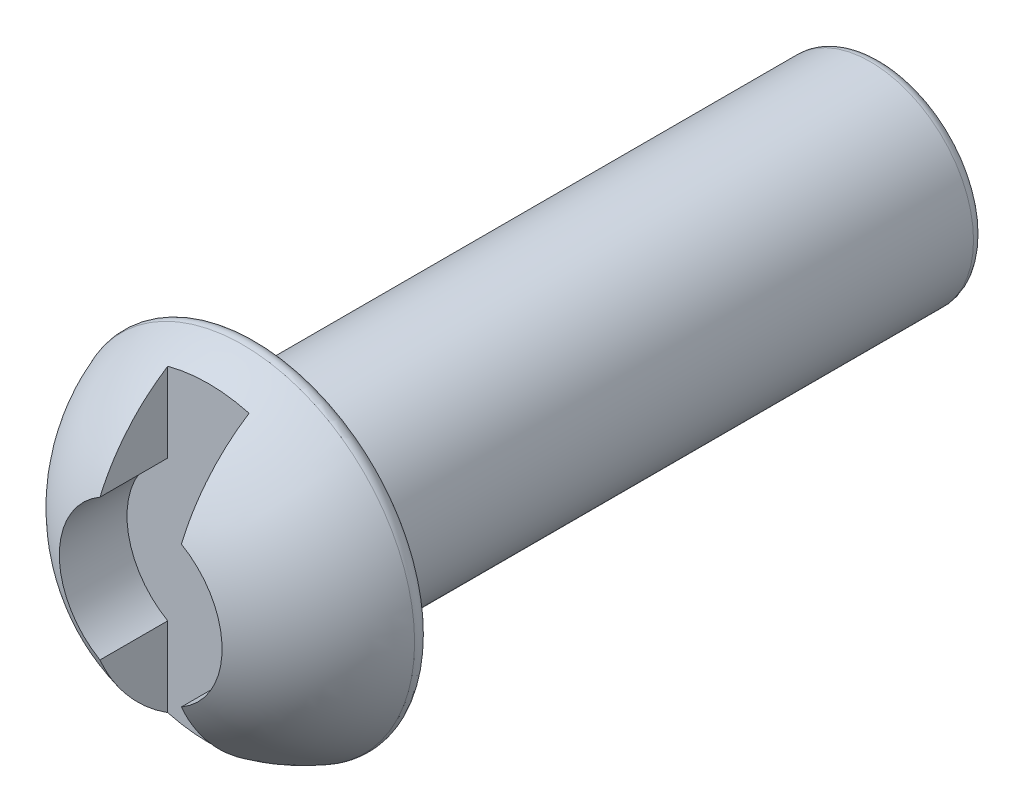
ISO-10303-21;
HEADER;
FILE_DESCRIPTION(('STEP AP214'),'2;1');
FILE_NAME('part.step','',(''),(''),'','','');
FILE_SCHEMA(('AUTOMOTIVE_DESIGN { 1 0 10303 214 1 1 1 1 }'));
ENDSEC;
DATA;
#1=APPLICATION_CONTEXT('core data for automotive mechanical design processes');
#2=APPLICATION_PROTOCOL_DEFINITION('international standard','automotive_design',2000,#1);
#3=PRODUCT_CONTEXT('',#1,'mechanical');
#4=PRODUCT('Part','Part','',(#3));
#5=PRODUCT_RELATED_PRODUCT_CATEGORY('part','',(#4));
#6=PRODUCT_DEFINITION_FORMATION('','',#4);
#7=PRODUCT_DEFINITION_CONTEXT('part definition',#1,'design');
#8=PRODUCT_DEFINITION('design','',#6,#7);
#9=PRODUCT_DEFINITION_SHAPE('','',#8);
#10=(LENGTH_UNIT() NAMED_UNIT(*) SI_UNIT(.MILLI.,.METRE.));
#11=(NAMED_UNIT(*) PLANE_ANGLE_UNIT() SI_UNIT($,.RADIAN.));
#12=(NAMED_UNIT(*) SI_UNIT($,.STERADIAN.) SOLID_ANGLE_UNIT());
#13=UNCERTAINTY_MEASURE_WITH_UNIT(LENGTH_MEASURE(1.E-05),#10,'distance_accuracy_value','');
#14=(GEOMETRIC_REPRESENTATION_CONTEXT(3) GLOBAL_UNCERTAINTY_ASSIGNED_CONTEXT((#13)) GLOBAL_UNIT_ASSIGNED_CONTEXT((#10,
#11,#12)) REPRESENTATION_CONTEXT('',''));
#15=CARTESIAN_POINT('',(0.,0.,0.));
#16=DIRECTION('',(0.,0.,1.));
#17=DIRECTION('',(1.,0.,0.));
#18=AXIS2_PLACEMENT_3D('',#15,#16,#17);
#19=CARTESIAN_POINT('',(0.,0.,-1.67999972471323));
#20=DIRECTION('',(0.,0.,1.));
#21=DIRECTION('',(1.,0.,0.));
#22=AXIS2_PLACEMENT_3D('',#19,#20,#21);
#23=DEGENERATE_TOROIDAL_SURFACE('',#22,0.000961750220595668,1.68,.T.);
#24=CARTESIAN_POINT('',(0.,0.,-1.11645571362575));
#25=DIRECTION('',(0.,0.,-1.));
#26=DIRECTION('',(-1.,0.,0.));
#27=AXIS2_PLACEMENT_3D('',#24,#25,#26);
#28=CIRCLE('',#27,1.58362347894453);
#29=CARTESIAN_POINT('',(-1.58362347894453,0.,-1.11645571362575));
#30=VERTEX_POINT('',#29);
#31=EDGE_CURVE('E170',#30,#30,#28,.F.);
#32=ORIENTED_EDGE('',*,*,#31,.T.);
#33=EDGE_LOOP('',(#32));
#34=FACE_BOUND('',#33,.T.);
#35=CARTESIAN_POINT('',(-0.375,-1.08816453655686,-0.455301433851489));
#36=CARTESIAN_POINT('',(-0.375,-1.0193633155418,-0.394226964882375));
#37=CARTESIAN_POINT('',(-0.375,-0.945353952070427,-0.338918499950808));
#38=CARTESIAN_POINT('',(-0.375,-0.789038613208102,-0.241468010537382));
#39=CARTESIAN_POINT('',(-0.375,-0.706722851960601,-0.199341761416896));
#40=CARTESIAN_POINT('',(-0.375,-0.536217463997199,-0.129522533491173));
#41=CARTESIAN_POINT('',(-0.375,-0.448030543617562,-0.101822955893846));
#42=CARTESIAN_POINT('',(-0.375,-0.268282595523437,-0.0616187256035907));
#43=CARTESIAN_POINT('',(-0.375,-0.176722315763622,-0.0491107252163106));
#44=CARTESIAN_POINT('',(-0.375,0.00729905673853977,-0.0395969264894861));
#45=CARTESIAN_POINT('',(-0.375,0.0997610123577057,-0.0426078143593755));
#46=CARTESIAN_POINT('',(-0.375,0.282873015912053,-0.0640969128108682));
#47=CARTESIAN_POINT('',(-0.375,0.373523022470033,-0.08257547619611));
#48=CARTESIAN_POINT('',(-0.375,0.550498602514875,-0.134517893951816));
#49=CARTESIAN_POINT('',(-0.375,0.636820855391359,-0.167993065062838));
#50=CARTESIAN_POINT('',(-0.375,0.802607082722554,-0.248982840807908));
#51=CARTESIAN_POINT('',(-0.375,0.882071050110512,-0.296497459907932));
#52=CARTESIAN_POINT('',(-0.375,1.03175712880534,-0.404128815118014));
#53=CARTESIAN_POINT('',(-0.375,1.1019936602616,-0.464225498019089));
#54=CARTESIAN_POINT('',(-0.375,1.23137722857827,-0.595359776892776));
#55=CARTESIAN_POINT('',(-0.375,1.29052433355385,-0.666397305657974));
#56=CARTESIAN_POINT('',(-0.375,1.39603688605121,-0.817378410836047));
#57=CARTESIAN_POINT('',(-0.375,1.44240531397182,-0.897319904439824));
#58=CARTESIAN_POINT('',(-0.375,1.52106240687032,-1.06385315568539));
#59=CARTESIAN_POINT('',(-0.375,1.5533510643779,-1.15044491685559));
#60=CARTESIAN_POINT('',(-0.375,1.6029307219788,-1.32781653535508));
#61=CARTESIAN_POINT('',(-0.375,1.62022236367697,-1.41859621334119));
#62=CARTESIAN_POINT('',(-0.375,1.63931943924794,-1.60177011922113));
#63=CARTESIAN_POINT('',(-0.375,1.6411248725501,-1.69416434717446));
#64=CARTESIAN_POINT('',(-0.375,1.62919832889859,-1.87794356444425));
#65=CARTESIAN_POINT('',(-0.375,1.61546650624284,-1.96932856377409));
#66=CARTESIAN_POINT('',(-0.375,1.57285556685113,-2.14849601166505));
#67=CARTESIAN_POINT('',(-0.375,1.54397646701572,-2.23627846424558));
#68=CARTESIAN_POINT('',(-0.375,1.4718908366213,-2.40574911606736));
#69=CARTESIAN_POINT('',(-0.375,1.42868430112963,-2.48743731321048));
#70=CARTESIAN_POINT('',(-0.375,1.3291702504303,-2.64240093326247));
#71=CARTESIAN_POINT('',(-0.375,1.27286268846168,-2.71567632614248));
#72=CARTESIAN_POINT('',(-0.375,1.14874406505465,-2.85173552775054));
#73=CARTESIAN_POINT('',(-0.375,1.08093278423466,-2.91451913634977));
#74=CARTESIAN_POINT('',(-0.375,0.935733492673192,-3.02781078947794));
#75=CARTESIAN_POINT('',(-0.375,0.858345577294134,-3.0783189562287));
#76=CARTESIAN_POINT('',(-0.375,0.696184820086576,-3.16563116108362));
#77=CARTESIAN_POINT('',(-0.375,0.611411535376129,-3.20243437663747));
#78=CARTESIAN_POINT('',(-0.375,0.436889940549795,-3.26129169957216));
#79=CARTESIAN_POINT('',(-0.375,0.347141557060869,-3.2833455893664));
#80=CARTESIAN_POINT('',(-0.375,0.165177528852073,-3.31210121830764));
#81=CARTESIAN_POINT('',(-0.375,0.0729607773299847,-3.31879594975541));
#82=CARTESIAN_POINT('',(-0.375,-0.11129167272008,-3.31664485302977));
#83=CARTESIAN_POINT('',(-0.375,-0.203327370463088,-3.30779895762718));
#84=CARTESIAN_POINT('',(-0.375,-0.384762730010887,-3.274763575842));
#85=CARTESIAN_POINT('',(-0.375,-0.474157760193703,-3.25054863207957));
#86=CARTESIAN_POINT('',(-0.375,-0.647600743240586,-3.18742827819012));
#87=CARTESIAN_POINT('',(-0.375,-0.731648759068334,-3.14852304108582));
#88=CARTESIAN_POINT('',(-0.375,-0.891869752445698,-3.05720370998941));
#89=CARTESIAN_POINT('',(-0.375,-0.968055474925294,-3.00481197552144));
#90=CARTESIAN_POINT('',(-0.375,-1.11054502600966,-2.88797590613748));
#91=CARTESIAN_POINT('',(-0.375,-1.17684881649939,-2.82353152473606));
#92=CARTESIAN_POINT('',(-0.375,-1.29766140496645,-2.68445362042874));
#93=CARTESIAN_POINT('',(-0.375,-1.35217565281293,-2.60982483153159));
#94=CARTESIAN_POINT('',(-0.375,-1.44790025695177,-2.45247388924376));
#95=CARTESIAN_POINT('',(-0.375,-1.48911063294411,-2.36975174783772));
#96=CARTESIAN_POINT('',(-0.375,-1.55705579239507,-2.19856677324239));
#97=CARTESIAN_POINT('',(-0.375,-1.58379127315312,-2.11010421681618));
#98=CARTESIAN_POINT('',(-0.375,-1.62202974083338,-1.92994944309824));
#99=CARTESIAN_POINT('',(-0.375,-1.63353331284022,-1.83825734999765));
#100=CARTESIAN_POINT('',(-0.375,-1.6409834286051,-1.65425502905623));
#101=CARTESIAN_POINT('',(-0.375,-1.63693186144657,-1.56194487763423));
#102=CARTESIAN_POINT('',(-0.375,-1.61338582894324,-1.37929001883597));
#103=CARTESIAN_POINT('',(-0.375,-1.59388752710654,-1.28894580546634));
#104=CARTESIAN_POINT('',(-0.375,-1.53999213091714,-1.1127785921773));
#105=CARTESIAN_POINT('',(-0.375,-1.50558794435343,-1.02695776631263));
#106=CARTESIAN_POINT('',(-0.375,-1.42287685086423,-0.862388873238906));
#107=CARTESIAN_POINT('',(-0.375,-1.37458673143996,-0.783632415447861));
#108=CARTESIAN_POINT('',(-0.375,-1.28602106644373,-0.663234074828633));
#109=CARTESIAN_POINT('',(-0.375,-1.2495358586588,-0.618753250323911));
#110=CARTESIAN_POINT('',(-0.375,-1.1720995677754,-0.53386522621084));
#111=CARTESIAN_POINT('',(-0.375,-1.13114847147736,-0.493458038643391));
#112=CARTESIAN_POINT('',(-0.375,-1.08816453655686,-0.455301433851489));
#113=B_SPLINE_CURVE_WITH_KNOTS('',3,(#35,#36,#37,#38,#39,#40,#41,#42,#43,#44,#45,#46,#47,#48,
#49,#50,#51,#52,#53,#54,#55,#56,#57,#58,#59,#60,#61,#62,#63,#64,#65,#66,#67,#68,#69,#70,#71,#72,
#73,#74,#75,#76,#77,#78,#79,#80,#81,#82,#83,#84,#85,#86,#87,#88,#89,#90,#91,#92,#93,#94,#95,#96,
#97,#98,#99,#100,#101,#102,#103,#104,#105,#106,#107,#108,#109,#110,#111,#112),.UNSPECIFIED.,.T.,
.F.,(4,2,2,2,2,2,2,2,2,2,2,2,2,2,2,2,2,2,2,2,2,2,2,2,2,2,2,2,2,2,2,2,2,2,2,2,2,2,4),(0.,
0.275785279713676,0.551899344808048,0.827887003544667,1.1038138331754,1.38003740653076,
1.65626728046679,1.93270595504042,2.20914491445214,2.4851465963364,2.7611465828655,
3.03708214273035,3.31301784899817,3.58894174955555,3.86486566028028,4.14078683087446,
4.41670769361066,4.69262865134096,4.96855059391976,5.24447779905739,5.52040225678211,
5.79634327240435,6.07228835870361,6.34835932142694,6.62443147844368,6.90096212065297,
7.17748950597725,7.45356135129347,7.72963426140335,8.00557927914445,8.28152388827241,
8.55745520313189,8.8333759186727,9.10926312626717,9.3852188772152,9.66130607218422,
9.93706088278642,10.1093587185268,10.2816570635322),.UNSPECIFIED.);
#114=CARTESIAN_POINT('',(-0.375,-1.38207420189661,-0.8));
#115=VERTEX_POINT('',#114);
#116=CARTESIAN_POINT('',(-0.375,-0.64951905283833,-0.176223910182547));
#117=VERTEX_POINT('',#116);
#118=EDGE_CURVE('E126',#115,#117,#113,.T.);
#119=ORIENTED_EDGE('',*,*,#118,.T.);
#120=CARTESIAN_POINT('',(0.,0.,-0.176223910182547));
#121=DIRECTION('',(0.,0.,-1.));
#122=DIRECTION('',(-1.,0.,0.));
#123=AXIS2_PLACEMENT_3D('',#120,#121,#122);
#124=CIRCLE('',#123,0.75);
#125=CARTESIAN_POINT('',(-0.375,0.649519052838328,-0.176223910182661));
#126=VERTEX_POINT('',#125);
#127=EDGE_CURVE('E164',#117,#126,#124,.T.);
#128=ORIENTED_EDGE('',*,*,#127,.T.);
#129=CARTESIAN_POINT('',(-0.375,1.08816453655686,-0.455301433851488));
#130=CARTESIAN_POINT('',(-0.375,1.1569557939413,-0.516377969699882));
#131=CARTESIAN_POINT('',(-0.375,1.22063930215199,-0.583308249463011));
#132=CARTESIAN_POINT('',(-0.375,1.33591665186027,-0.72696742706281));
#133=CARTESIAN_POINT('',(-0.375,1.38749588741375,-0.803707992088763));
#134=CARTESIAN_POINT('',(-0.375,1.47701489302311,-0.964730737565006));
#135=CARTESIAN_POINT('',(-0.375,1.51496124994498,-1.049009251327));
#136=CARTESIAN_POINT('',(-0.375,1.5761544991868,-1.22271804889625));
#137=CARTESIAN_POINT('',(-0.375,1.59940502406833,-1.31214705362098));
#138=CARTESIAN_POINT('',(-0.375,1.63056531668596,-1.49364649792679));
#139=CARTESIAN_POINT('',(-0.375,1.63847391198444,-1.5857171388374));
#140=CARTESIAN_POINT('',(-0.375,1.63872157461856,-1.76988284424885));
#141=CARTESIAN_POINT('',(-0.375,1.63106003439355,-1.86197790956254));
#142=CARTESIAN_POINT('',(-0.375,1.60038428876192,-2.04357235261792));
#143=CARTESIAN_POINT('',(-0.375,1.57737045462467,-2.13307179307581));
#144=CARTESIAN_POINT('',(-0.375,1.51664388776768,-2.30693642101401));
#145=CARTESIAN_POINT('',(-0.375,1.47893119816764,-2.39130162355497));
#146=CARTESIAN_POINT('',(-0.375,1.38987733347551,-2.55250372752547));
#147=CARTESIAN_POINT('',(-0.375,1.33853608409835,-2.62934058791723));
#148=CARTESIAN_POINT('',(-0.375,1.22368267266566,-2.77330464621602));
#149=CARTESIAN_POINT('',(-0.375,1.16017048692079,-2.84043182522384));
#150=CARTESIAN_POINT('',(-0.375,1.02277640438475,-2.96307305538894));
#151=CARTESIAN_POINT('',(-0.375,0.948894207367808,-3.01858677020487));
#152=CARTESIAN_POINT('',(-0.375,0.792860258021709,-3.11642313134859));
#153=CARTESIAN_POINT('',(-0.375,0.710708606767763,-3.15874593887923));
#154=CARTESIAN_POINT('',(-0.375,0.540459379653211,-3.22900626508814));
#155=CARTESIAN_POINT('',(-0.375,0.452361248802069,-3.2569424389428));
#156=CARTESIAN_POINT('',(-0.375,0.272725801096525,-3.29763964904739));
#157=CARTESIAN_POINT('',(-0.375,0.181188387957184,-3.31040026012056));
#158=CARTESIAN_POINT('',(-0.375,-0.00281803456398457,-3.32041652694565));
#159=CARTESIAN_POINT('',(-0.375,-0.0952878494473202,-3.31765737795415));
#160=CARTESIAN_POINT('',(-0.375,-0.278454345956691,-3.29666791861452));
#161=CARTESIAN_POINT('',(-0.375,-0.369151056064361,-3.27843785698709));
#162=CARTESIAN_POINT('',(-0.375,-0.546266031779403,-3.22698056126414));
#163=CARTESIAN_POINT('',(-0.375,-0.632680782452629,-3.19374122562253));
#164=CARTESIAN_POINT('',(-0.375,-0.798690406664462,-3.11320400130442));
#165=CARTESIAN_POINT('',(-0.375,-0.87828526151497,-3.0659060741057));
#166=CARTESIAN_POINT('',(-0.375,-1.02826639436723,-2.95868315736393));
#167=CARTESIAN_POINT('',(-0.375,-1.09866714850422,-2.89877841539359));
#168=CARTESIAN_POINT('',(-0.375,-1.22840915393068,-2.76799755356467));
#169=CARTESIAN_POINT('',(-0.375,-1.28775045137013,-2.69712147949061));
#170=CARTESIAN_POINT('',(-0.375,-1.39367539334208,-2.5464286316179));
#171=CARTESIAN_POINT('',(-0.375,-1.44026206773569,-2.46661398753569));
#172=CARTESIAN_POINT('',(-0.375,-1.51937378700525,-2.30029609058693));
#173=CARTESIAN_POINT('',(-0.375,-1.55189884202741,-2.21379284254662));
#174=CARTESIAN_POINT('',(-0.375,-1.60196278271244,-2.03655732690778));
#175=CARTESIAN_POINT('',(-0.375,-1.61950231380201,-1.94582524162282));
#176=CARTESIAN_POINT('',(-0.375,-1.63909965228883,-1.7627041523083));
#177=CARTESIAN_POINT('',(-0.375,-1.64115744634324,-1.6703151468508));
#178=CARTESIAN_POINT('',(-0.375,-1.6297329071146,-1.48650392960841));
#179=CARTESIAN_POINT('',(-0.375,-1.61625072747267,-1.39508170827411));
#180=CARTESIAN_POINT('',(-0.375,-1.57412929628837,-1.21579854229671));
#181=CARTESIAN_POINT('',(-0.375,-1.54549007948448,-1.12793758949203));
#182=CARTESIAN_POINT('',(-0.375,-1.4738676519627,-0.958270808660796));
#183=CARTESIAN_POINT('',(-0.375,-1.4308844419071,-0.876464980354668));
#184=CARTESIAN_POINT('',(-0.375,-1.33179404394359,-0.721230128921969));
#185=CARTESIAN_POINT('',(-0.375,-1.27568678576903,-0.647801150648499));
#186=CARTESIAN_POINT('',(-0.375,-1.15194027022298,-0.511403488979464));
#187=CARTESIAN_POINT('',(-0.375,-1.08430081789356,-0.448434982459323));
#188=CARTESIAN_POINT('',(-0.375,-0.939411536381032,-0.334747189703588));
#189=CARTESIAN_POINT('',(-0.375,-0.862161781771648,-0.284027808426589));
#190=CARTESIAN_POINT('',(-0.375,-0.700238490469226,-0.19627219813359));
#191=CARTESIAN_POINT('',(-0.375,-0.615564374900495,-0.159237037248989));
#192=CARTESIAN_POINT('',(-0.375,-0.441203996765171,-0.0999041287562116));
#193=CARTESIAN_POINT('',(-0.375,-0.351517859575946,-0.0776060126748333));
#194=CARTESIAN_POINT('',(-0.375,-0.169647471052366,-0.0483562602443181));
#195=CARTESIAN_POINT('',(-0.375,-0.0774623756938163,-0.0414098760029871));
#196=CARTESIAN_POINT('',(-0.375,0.10679453839713,-0.0430555130982441));
#197=CARTESIAN_POINT('',(-0.375,0.198866322509084,-0.0516514720016835));
#198=CARTESIAN_POINT('',(-0.375,0.380452025640056,-0.0841996629049598));
#199=CARTESIAN_POINT('',(-0.375,0.469960019145799,-0.108184873758095));
#200=CARTESIAN_POINT('',(-0.375,0.64358568093885,-0.170860638066259));
#201=CARTESIAN_POINT('',(-0.375,0.727709767095509,-0.209533286958639));
#202=CARTESIAN_POINT('',(-0.375,0.857997618725154,-0.283313029006732));
#203=CARTESIAN_POINT('',(-0.375,0.906544103760259,-0.314296176585142));
#204=CARTESIAN_POINT('',(-0.375,1.00011461927499,-0.381190034022671));
#205=CARTESIAN_POINT('',(-0.375,1.0451386409927,-0.417100756138213));
#206=CARTESIAN_POINT('',(-0.375,1.08816453655686,-0.455301433851488));
#207=B_SPLINE_CURVE_WITH_KNOTS('',3,(#129,#130,#131,#132,#133,#134,#135,#136,#137,#138,#139,
#140,#141,#142,#143,#144,#145,#146,#147,#148,#149,#150,#151,#152,#153,#154,#155,#156,#157,#158,
#159,#160,#161,#162,#163,#164,#165,#166,#167,#168,#169,#170,#171,#172,#173,#174,#175,#176,#177,
#178,#179,#180,#181,#182,#183,#184,#185,#186,#187,#188,#189,#190,#191,#192,#193,#194,#195,#196,
#197,#198,#199,#200,#201,#202,#203,#204,#205,#206),.UNSPECIFIED.,.T.,.F.,(4,2,2,2,2,2,2,2,2,2,2,
2,2,2,2,2,2,2,2,2,2,2,2,2,2,2,2,2,2,2,2,2,2,2,2,2,2,2,4),(0.,0.275766825158298,
0.551864720070482,0.827829035461619,1.10372511042891,1.37964226867629,1.65557019366527,
1.93149144604379,2.20741188900184,2.48333383594745,2.75925631994885,3.03518679392589,
3.31111389569197,3.587066785698,3.86302740694903,4.13925131955373,4.4154707914825,
4.69191336999034,4.96835670599075,5.24435939436287,5.52036093097788,5.79629684641928,
6.0722325627576,6.34815639394218,6.62408046292986,6.90000180392571,7.17592251253905,
7.45184320841269,7.72776538160986,8.00369221988204,8.27961691715912,8.55556314738399,
8.83150247781047,9.10753619751647,9.38363985864066,9.66033718951403,9.93669829257645,
10.1091778424165,10.2816578212751),.UNSPECIFIED.);
#208=CARTESIAN_POINT('',(-0.375,1.38207420189661,-0.8));
#209=VERTEX_POINT('',#208);
#210=EDGE_CURVE('E100',#126,#209,#207,.T.);
#211=ORIENTED_EDGE('',*,*,#210,.T.);
#212=CARTESIAN_POINT('',(0.,0.,-0.8));
#213=DIRECTION('',(0.,0.,1.));
#214=DIRECTION('',(1.,0.,0.));
#215=AXIS2_PLACEMENT_3D('',#212,#213,#214);
#216=CIRCLE('',#215,1.43204542509941);
#217=CARTESIAN_POINT('',(0.375,1.38207420189661,-0.8));
#218=VERTEX_POINT('',#217);
#219=EDGE_CURVE('E92',#218,#209,#216,.T.);
#220=ORIENTED_EDGE('',*,*,#219,.F.);
#221=CARTESIAN_POINT('',(0.375,1.08816453655686,-0.455301433851488));
#222=CARTESIAN_POINT('',(0.375,1.0193633155418,-0.394226964882374));
#223=CARTESIAN_POINT('',(0.375,0.945353952070427,-0.338918499950808));
#224=CARTESIAN_POINT('',(0.375,0.789038613208102,-0.241468010537382));
#225=CARTESIAN_POINT('',(0.375,0.706722851960601,-0.199341761416896));
#226=CARTESIAN_POINT('',(0.375,0.536217463997199,-0.129522533491173));
#227=CARTESIAN_POINT('',(0.375,0.448030543617561,-0.101822955893846));
#228=CARTESIAN_POINT('',(0.375,0.268282595523437,-0.0616187256035906));
#229=CARTESIAN_POINT('',(0.375,0.176722315763622,-0.0491107252163107));
#230=CARTESIAN_POINT('',(0.375,-0.00729905673853999,-0.0395969264894861));
#231=CARTESIAN_POINT('',(0.375,-0.0997610123577058,-0.0426078143593753));
#232=CARTESIAN_POINT('',(0.375,-0.282873015912053,-0.064096912810868));
#233=CARTESIAN_POINT('',(0.375,-0.373523022470033,-0.0825754761961099));
#234=CARTESIAN_POINT('',(0.375,-0.550498602514875,-0.134517893951816));
#235=CARTESIAN_POINT('',(0.375,-0.636820855391359,-0.167993065062838));
#236=CARTESIAN_POINT('',(0.375,-0.802607082722554,-0.248982840807908));
#237=CARTESIAN_POINT('',(0.375,-0.882071050110511,-0.296497459907932));
#238=CARTESIAN_POINT('',(0.375,-1.03175712880534,-0.404128815118014));
#239=CARTESIAN_POINT('',(0.375,-1.1019936602616,-0.464225498019089));
#240=CARTESIAN_POINT('',(0.375,-1.23137722857828,-0.595359776892776));
#241=CARTESIAN_POINT('',(0.375,-1.29052433355385,-0.666397305657974));
#242=CARTESIAN_POINT('',(0.375,-1.39603688605121,-0.817378410836048));
#243=CARTESIAN_POINT('',(0.375,-1.44240531397182,-0.897319904439824));
#244=CARTESIAN_POINT('',(0.375,-1.52106240687032,-1.06385315568539));
#245=CARTESIAN_POINT('',(0.375,-1.5533510643779,-1.15044491685559));
#246=CARTESIAN_POINT('',(0.375,-1.6029307219788,-1.32781653535508));
#247=CARTESIAN_POINT('',(0.375,-1.62022236367697,-1.41859621334119));
#248=CARTESIAN_POINT('',(0.375,-1.63931943924794,-1.60177011922113));
#249=CARTESIAN_POINT('',(0.375,-1.6411248725501,-1.69416434717446));
#250=CARTESIAN_POINT('',(0.375,-1.62919832889859,-1.87794356444425));
#251=CARTESIAN_POINT('',(0.375,-1.61546650624284,-1.96932856377409));
#252=CARTESIAN_POINT('',(0.375,-1.57285556685113,-2.14849601166505));
#253=CARTESIAN_POINT('',(0.375,-1.54397646701572,-2.23627846424558));
#254=CARTESIAN_POINT('',(0.375,-1.4718908366213,-2.40574911606736));
#255=CARTESIAN_POINT('',(0.375,-1.42868430112963,-2.48743731321048));
#256=CARTESIAN_POINT('',(0.375,-1.3291702504303,-2.64240093326247));
#257=CARTESIAN_POINT('',(0.375,-1.27286268846168,-2.71567632614248));
#258=CARTESIAN_POINT('',(0.375,-1.14874406505464,-2.85173552775054));
#259=CARTESIAN_POINT('',(0.375,-1.08093278423466,-2.91451913634977));
#260=CARTESIAN_POINT('',(0.375,-0.935733492673191,-3.02781078947794));
#261=CARTESIAN_POINT('',(0.375,-0.858345577294133,-3.07831895622871));
#262=CARTESIAN_POINT('',(0.375,-0.696184820086576,-3.16563116108362));
#263=CARTESIAN_POINT('',(0.375,-0.611411535376129,-3.20243437663747));
#264=CARTESIAN_POINT('',(0.375,-0.436889940549795,-3.26129169957216));
#265=CARTESIAN_POINT('',(0.375,-0.347141557060869,-3.2833455893664));
#266=CARTESIAN_POINT('',(0.375,-0.165177528852074,-3.31210121830764));
#267=CARTESIAN_POINT('',(0.375,-0.0729607773299849,-3.31879594975541));
#268=CARTESIAN_POINT('',(0.375,0.11129167272008,-3.31664485302977));
#269=CARTESIAN_POINT('',(0.375,0.203327370463088,-3.30779895762718));
#270=CARTESIAN_POINT('',(0.375,0.384762730010887,-3.274763575842));
#271=CARTESIAN_POINT('',(0.375,0.474157760193703,-3.25054863207957));
#272=CARTESIAN_POINT('',(0.375,0.647600743240586,-3.18742827819012));
#273=CARTESIAN_POINT('',(0.375,0.731648759068334,-3.14852304108582));
#274=CARTESIAN_POINT('',(0.375,0.891869752445698,-3.05720370998941));
#275=CARTESIAN_POINT('',(0.375,0.968055474925294,-3.00481197552144));
#276=CARTESIAN_POINT('',(0.375,1.11054502600966,-2.88797590613748));
#277=CARTESIAN_POINT('',(0.375,1.17684881649939,-2.82353152473606));
#278=CARTESIAN_POINT('',(0.375,1.29766140496645,-2.68445362042874));
#279=CARTESIAN_POINT('',(0.375,1.35217565281293,-2.60982483153159));
#280=CARTESIAN_POINT('',(0.375,1.44790025695178,-2.45247388924376));
#281=CARTESIAN_POINT('',(0.375,1.48911063294411,-2.36975174783772));
#282=CARTESIAN_POINT('',(0.375,1.55705579239507,-2.19856677324239));
#283=CARTESIAN_POINT('',(0.375,1.58379127315312,-2.11010421681618));
#284=CARTESIAN_POINT('',(0.375,1.62202974083338,-1.92994944309824));
#285=CARTESIAN_POINT('',(0.375,1.63353331284022,-1.83825734999765));
#286=CARTESIAN_POINT('',(0.375,1.6409834286051,-1.65425502905623));
#287=CARTESIAN_POINT('',(0.375,1.63693186144657,-1.56194487763423));
#288=CARTESIAN_POINT('',(0.375,1.61338582894324,-1.37929001883597));
#289=CARTESIAN_POINT('',(0.375,1.59388752710654,-1.28894580546634));
#290=CARTESIAN_POINT('',(0.375,1.53999213091714,-1.1127785921773));
#291=CARTESIAN_POINT('',(0.375,1.50558794435343,-1.02695776631263));
#292=CARTESIAN_POINT('',(0.375,1.42287685086423,-0.862388873238906));
#293=CARTESIAN_POINT('',(0.375,1.37458673143996,-0.78363241544786));
#294=CARTESIAN_POINT('',(0.375,1.28602106644373,-0.663234074828633));
#295=CARTESIAN_POINT('',(0.375,1.2495358586588,-0.618753250323911));
#296=CARTESIAN_POINT('',(0.375,1.1720995677754,-0.533865226210839));
#297=CARTESIAN_POINT('',(0.375,1.13114847147736,-0.493458038643391));
#298=CARTESIAN_POINT('',(0.375,1.08816453655686,-0.455301433851488));
#299=B_SPLINE_CURVE_WITH_KNOTS('',3,(#221,#222,#223,#224,#225,#226,#227,#228,#229,#230,#231,
#232,#233,#234,#235,#236,#237,#238,#239,#240,#241,#242,#243,#244,#245,#246,#247,#248,#249,#250,
#251,#252,#253,#254,#255,#256,#257,#258,#259,#260,#261,#262,#263,#264,#265,#266,#267,#268,#269,
#270,#271,#272,#273,#274,#275,#276,#277,#278,#279,#280,#281,#282,#283,#284,#285,#286,#287,#288,
#289,#290,#291,#292,#293,#294,#295,#296,#297,#298),.UNSPECIFIED.,.T.,.F.,(4,2,2,2,2,2,2,2,2,2,2,
2,2,2,2,2,2,2,2,2,2,2,2,2,2,2,2,2,2,2,2,2,2,2,2,2,2,2,4),(0.,0.275785279713676,
0.551899344808048,0.827887003544667,1.1038138331754,1.38003740653076,1.65626728046679,
1.93270595504042,2.20914491445213,2.4851465963364,2.7611465828655,3.03708214273035,
3.31301784899817,3.58894174955555,3.86486566028028,4.14078683087446,4.41670769361066,
4.69262865134096,4.96855059391976,5.24447779905739,5.52040225678211,5.79634327240435,
6.07228835870361,6.34835932142694,6.62443147844368,6.90096212065297,7.17748950597725,
7.45356135129347,7.72963426140335,8.00557927914446,8.28152388827241,8.55745520313189,
8.8333759186727,9.10926312626718,9.3852188772152,9.66130607218422,9.93706088278642,
10.1093587185268,10.2816570635322),.UNSPECIFIED.);
#300=CARTESIAN_POINT('',(0.375,0.649519052838328,-0.176223910182547));
#301=VERTEX_POINT('',#300);
#302=EDGE_CURVE('E165',#218,#301,#299,.T.);
#303=ORIENTED_EDGE('',*,*,#302,.T.);
#304=CARTESIAN_POINT('',(0.,0.,-0.176223910182547));
#305=DIRECTION('',(0.,0.,-1.));
#306=DIRECTION('',(-1.,0.,0.));
#307=AXIS2_PLACEMENT_3D('',#304,#305,#306);
#308=CIRCLE('',#307,0.75);
#309=CARTESIAN_POINT('',(0.375,-0.64951905283833,-0.176223910182661));
#310=VERTEX_POINT('',#309);
#311=EDGE_CURVE('E55',#301,#310,#308,.T.);
#312=ORIENTED_EDGE('',*,*,#311,.T.);
#313=CARTESIAN_POINT('',(0.375,-1.08816453655686,-0.455301433851488));
#314=CARTESIAN_POINT('',(0.375,-1.1569557939413,-0.516377969699883));
#315=CARTESIAN_POINT('',(0.375,-1.22063930215199,-0.583308249463011));
#316=CARTESIAN_POINT('',(0.375,-1.33591665186028,-0.726967427062811));
#317=CARTESIAN_POINT('',(0.375,-1.38749588741375,-0.803707992088763));
#318=CARTESIAN_POINT('',(0.375,-1.47701489302311,-0.964730737565007));
#319=CARTESIAN_POINT('',(0.375,-1.51496124994498,-1.049009251327));
#320=CARTESIAN_POINT('',(0.375,-1.5761544991868,-1.22271804889625));
#321=CARTESIAN_POINT('',(0.375,-1.59940502406833,-1.31214705362098));
#322=CARTESIAN_POINT('',(0.375,-1.63056531668596,-1.49364649792679));
#323=CARTESIAN_POINT('',(0.375,-1.63847391198444,-1.5857171388374));
#324=CARTESIAN_POINT('',(0.375,-1.63872157461856,-1.76988284424885));
#325=CARTESIAN_POINT('',(0.375,-1.63106003439355,-1.86197790956254));
#326=CARTESIAN_POINT('',(0.375,-1.60038428876192,-2.04357235261792));
#327=CARTESIAN_POINT('',(0.375,-1.57737045462467,-2.13307179307581));
#328=CARTESIAN_POINT('',(0.375,-1.51664388776768,-2.30693642101401));
#329=CARTESIAN_POINT('',(0.375,-1.47893119816764,-2.39130162355497));
#330=CARTESIAN_POINT('',(0.375,-1.38987733347551,-2.55250372752547));
#331=CARTESIAN_POINT('',(0.375,-1.33853608409835,-2.62934058791723));
#332=CARTESIAN_POINT('',(0.375,-1.22368267266566,-2.77330464621602));
#333=CARTESIAN_POINT('',(0.375,-1.16017048692079,-2.84043182522384));
#334=CARTESIAN_POINT('',(0.375,-1.02277640438475,-2.96307305538894));
#335=CARTESIAN_POINT('',(0.375,-0.948894207367808,-3.01858677020487));
#336=CARTESIAN_POINT('',(0.375,-0.792860258021708,-3.11642313134859));
#337=CARTESIAN_POINT('',(0.375,-0.710708606767762,-3.15874593887923));
#338=CARTESIAN_POINT('',(0.375,-0.540459379653211,-3.22900626508814));
#339=CARTESIAN_POINT('',(0.375,-0.452361248802068,-3.2569424389428));
#340=CARTESIAN_POINT('',(0.375,-0.272725801096524,-3.29763964904739));
#341=CARTESIAN_POINT('',(0.375,-0.181188387957184,-3.31040026012056));
#342=CARTESIAN_POINT('',(0.375,0.00281803456398476,-3.32041652694565));
#343=CARTESIAN_POINT('',(0.375,0.0952878494473204,-3.31765737795415));
#344=CARTESIAN_POINT('',(0.375,0.278454345956691,-3.29666791861452));
#345=CARTESIAN_POINT('',(0.375,0.369151056064361,-3.27843785698709));
#346=CARTESIAN_POINT('',(0.375,0.546266031779403,-3.22698056126414));
#347=CARTESIAN_POINT('',(0.375,0.63268078245263,-3.19374122562253));
#348=CARTESIAN_POINT('',(0.375,0.798690406664462,-3.11320400130442));
#349=CARTESIAN_POINT('',(0.375,0.878285261514971,-3.0659060741057));
#350=CARTESIAN_POINT('',(0.375,1.02826639436723,-2.95868315736393));
#351=CARTESIAN_POINT('',(0.375,1.09866714850422,-2.89877841539359));
#352=CARTESIAN_POINT('',(0.375,1.22840915393068,-2.76799755356467));
#353=CARTESIAN_POINT('',(0.375,1.28775045137013,-2.69712147949061));
#354=CARTESIAN_POINT('',(0.375,1.39367539334208,-2.5464286316179));
#355=CARTESIAN_POINT('',(0.375,1.44026206773569,-2.46661398753569));
#356=CARTESIAN_POINT('',(0.375,1.51937378700525,-2.30029609058693));
#357=CARTESIAN_POINT('',(0.375,1.55189884202741,-2.21379284254662));
#358=CARTESIAN_POINT('',(0.375,1.60196278271244,-2.03655732690778));
#359=CARTESIAN_POINT('',(0.375,1.61950231380201,-1.94582524162282));
#360=CARTESIAN_POINT('',(0.375,1.63909965228883,-1.7627041523083));
#361=CARTESIAN_POINT('',(0.375,1.64115744634324,-1.6703151468508));
#362=CARTESIAN_POINT('',(0.375,1.6297329071146,-1.48650392960841));
#363=CARTESIAN_POINT('',(0.375,1.61625072747267,-1.3950817082741));
#364=CARTESIAN_POINT('',(0.375,1.57412929628837,-1.21579854229671));
#365=CARTESIAN_POINT('',(0.375,1.54549007948448,-1.12793758949203));
#366=CARTESIAN_POINT('',(0.375,1.4738676519627,-0.958270808660795));
#367=CARTESIAN_POINT('',(0.375,1.4308844419071,-0.876464980354668));
#368=CARTESIAN_POINT('',(0.375,1.33179404394359,-0.721230128921969));
#369=CARTESIAN_POINT('',(0.375,1.27568678576903,-0.647801150648499));
#370=CARTESIAN_POINT('',(0.375,1.15194027022298,-0.511403488979463));
#371=CARTESIAN_POINT('',(0.375,1.08430081789356,-0.448434982459323));
#372=CARTESIAN_POINT('',(0.375,0.939411536381032,-0.334747189703588));
#373=CARTESIAN_POINT('',(0.375,0.862161781771648,-0.284027808426588));
#374=CARTESIAN_POINT('',(0.375,0.700238490469226,-0.19627219813359));
#375=CARTESIAN_POINT('',(0.375,0.615564374900495,-0.159237037248989));
#376=CARTESIAN_POINT('',(0.375,0.441203996765171,-0.0999041287562116));
#377=CARTESIAN_POINT('',(0.375,0.351517859575945,-0.0776060126748334));
#378=CARTESIAN_POINT('',(0.375,0.169647471052365,-0.0483562602443183));
#379=CARTESIAN_POINT('',(0.375,0.077462375693816,-0.0414098760029872));
#380=CARTESIAN_POINT('',(0.375,-0.10679453839713,-0.043055513098244));
#381=CARTESIAN_POINT('',(0.375,-0.198866322509084,-0.0516514720016834));
#382=CARTESIAN_POINT('',(0.375,-0.380452025640056,-0.0841996629049596));
#383=CARTESIAN_POINT('',(0.375,-0.469960019145799,-0.108184873758094));
#384=CARTESIAN_POINT('',(0.375,-0.64358568093885,-0.170860638066259));
#385=CARTESIAN_POINT('',(0.375,-0.727709767095509,-0.209533286958639));
#386=CARTESIAN_POINT('',(0.375,-0.857997618725154,-0.283313029006732));
#387=CARTESIAN_POINT('',(0.375,-0.906544103760259,-0.314296176585143));
#388=CARTESIAN_POINT('',(0.375,-1.00011461927499,-0.381190034022671));
#389=CARTESIAN_POINT('',(0.375,-1.0451386409927,-0.417100756138213));
#390=CARTESIAN_POINT('',(0.375,-1.08816453655686,-0.455301433851488));
#391=B_SPLINE_CURVE_WITH_KNOTS('',3,(#313,#314,#315,#316,#317,#318,#319,#320,#321,#322,#323,
#324,#325,#326,#327,#328,#329,#330,#331,#332,#333,#334,#335,#336,#337,#338,#339,#340,#341,#342,
#343,#344,#345,#346,#347,#348,#349,#350,#351,#352,#353,#354,#355,#356,#357,#358,#359,#360,#361,
#362,#363,#364,#365,#366,#367,#368,#369,#370,#371,#372,#373,#374,#375,#376,#377,#378,#379,#380,
#381,#382,#383,#384,#385,#386,#387,#388,#389,#390),.UNSPECIFIED.,.T.,.F.,(4,2,2,2,2,2,2,2,2,2,2,
2,2,2,2,2,2,2,2,2,2,2,2,2,2,2,2,2,2,2,2,2,2,2,2,2,2,2,4),(0.,0.275766825158298,
0.551864720070482,0.827829035461618,1.10372511042891,1.37964226867629,1.65557019366527,
1.9314914460438,2.20741188900184,2.48333383594745,2.75925631994885,3.03518679392589,
3.31111389569197,3.58706678569801,3.86302740694903,4.13925131955373,4.4154707914825,
4.69191336999034,4.96835670599075,5.24435939436287,5.52036093097788,5.79629684641928,
6.0722325627576,6.34815639394218,6.62408046292986,6.90000180392571,7.17592251253905,
7.45184320841269,7.72776538160986,8.00369221988204,8.27961691715912,8.55556314738399,
8.83150247781047,9.10753619751647,9.38363985864066,9.66033718951403,9.93669829257645,
10.1091778424165,10.2816578212751),.UNSPECIFIED.);
#392=CARTESIAN_POINT('',(0.375,-1.38207420189661,-0.8));
#393=VERTEX_POINT('',#392);
#394=EDGE_CURVE('E134',#310,#393,#391,.T.);
#395=ORIENTED_EDGE('',*,*,#394,.T.);
#396=EDGE_CURVE('E124',#115,#393,#216,.T.);
#397=ORIENTED_EDGE('',*,*,#396,.F.);
#398=EDGE_LOOP('',(#119,#128,#211,#220,#303,#312,#395,#397));
#399=FACE_BOUND('',#398,.T.);
#400=ADVANCED_FACE('F32',(#34,#399),#23,.T.);
#401=CARTESIAN_POINT('',(0.,0.,-7.));
#402=DIRECTION('',(0.,0.,1.));
#403=DIRECTION('',(1.,0.,0.));
#404=AXIS2_PLACEMENT_3D('',#401,#402,#403);
#405=PLANE('',#404);
#406=CARTESIAN_POINT('',(0.,0.,-7.));
#407=DIRECTION('',(0.,0.,1.));
#408=DIRECTION('',(1.,0.,0.));
#409=AXIS2_PLACEMENT_3D('',#406,#407,#408);
#410=CIRCLE('',#409,0.85);
#411=CARTESIAN_POINT('',(0.85,0.,-7.));
#412=VERTEX_POINT('',#411);
#413=EDGE_CURVE('E11',#412,#412,#410,.F.);
#414=ORIENTED_EDGE('',*,*,#413,.T.);
#415=EDGE_LOOP('',(#414));
#416=FACE_BOUND('',#415,.T.);
#417=ADVANCED_FACE('F190',(#416),#405,.F.);
#418=CARTESIAN_POINT('',(0.,0.,0.));
#419=DIRECTION('',(0.,0.,1.));
#420=DIRECTION('',(1.,0.,0.));
#421=AXIS2_PLACEMENT_3D('',#418,#419,#420);
#422=CYLINDRICAL_SURFACE('',#421,0.95);
#423=CARTESIAN_POINT('',(0.,0.,-6.9));
#424=DIRECTION('',(0.,0.,1.));
#425=DIRECTION('',(1.,0.,0.));
#426=AXIS2_PLACEMENT_3D('',#423,#424,#425);
#427=CIRCLE('',#426,0.95);
#428=CARTESIAN_POINT('',(0.95,0.,-6.9));
#429=VERTEX_POINT('',#428);
#430=EDGE_CURVE('E40',#429,#429,#427,.T.);
#431=ORIENTED_EDGE('',*,*,#430,.T.);
#432=EDGE_LOOP('',(#431));
#433=FACE_BOUND('',#432,.T.);
#434=CARTESIAN_POINT('',(0.,0.,-1.25));
#435=DIRECTION('',(0.,0.,1.));
#436=DIRECTION('',(1.,0.,0.));
#437=AXIS2_PLACEMENT_3D('',#434,#435,#436);
#438=CIRCLE('',#437,0.949999999999999);
#439=CARTESIAN_POINT('',(0.949999999999999,0.,-1.25));
#440=VERTEX_POINT('',#439);
#441=EDGE_CURVE('E118',#440,#440,#438,.T.);
#442=ORIENTED_EDGE('',*,*,#441,.F.);
#443=EDGE_LOOP('',(#442));
#444=FACE_BOUND('',#443,.T.);
#445=ADVANCED_FACE('F178',(#433,#444),#422,.T.);
#446=CARTESIAN_POINT('',(0.,0.949999999999999,-1.25));
#447=DIRECTION('',(0.,0.,1.));
#448=DIRECTION('',(1.,0.,0.));
#449=AXIS2_PLACEMENT_3D('',#446,#447,#448);
#450=PLANE('',#449);
#451=CARTESIAN_POINT('',(0.,0.,-1.25));
#452=DIRECTION('',(0.,0.,1.));
#453=DIRECTION('',(1.,0.,0.));
#454=AXIS2_PLACEMENT_3D('',#451,#452,#453);
#455=CIRCLE('',#454,1.48941742366334);
#456=CARTESIAN_POINT('',(1.48941742366334,0.,-1.25));
#457=VERTEX_POINT('',#456);
#458=EDGE_CURVE('E173',#457,#457,#455,.F.);
#459=ORIENTED_EDGE('',*,*,#458,.T.);
#460=EDGE_LOOP('',(#459));
#461=FACE_BOUND('',#460,.T.);
#462=ORIENTED_EDGE('',*,*,#441,.T.);
#463=EDGE_LOOP('',(#462));
#464=FACE_BOUND('',#463,.T.);
#465=ADVANCED_FACE('F209',(#461,#464),#450,.F.);
#466=CARTESIAN_POINT('',(0.375,0.649519052838328,-0.8));
#467=DIRECTION('',(1.,0.,0.));
#468=DIRECTION('',(0.,0.,-1.));
#469=AXIS2_PLACEMENT_3D('',#466,#467,#468);
#470=PLANE('',#469);
#471=DIRECTION('',(0.,1.,0.));
#472=VECTOR('',#471,1.);
#473=CARTESIAN_POINT('',(0.375,0.649519052838328,-0.8));
#474=LINE('',#473,#472);
#475=CARTESIAN_POINT('',(0.375,0.649519052838328,-0.8));
#476=VERTEX_POINT('',#475);
#477=EDGE_CURVE('E95',#476,#218,#474,.T.);
#478=ORIENTED_EDGE('',*,*,#477,.F.);
#479=DIRECTION('',(0.,0.,1.));
#480=VECTOR('',#479,1.);
#481=CARTESIAN_POINT('',(0.375,0.649519052838328,-0.8));
#482=LINE('',#481,#480);
#483=EDGE_CURVE('E116',#476,#301,#482,.T.);
#484=ORIENTED_EDGE('',*,*,#483,.T.);
#485=ORIENTED_EDGE('',*,*,#302,.F.);
#486=EDGE_LOOP('',(#478,#484,#485));
#487=FACE_BOUND('',#486,.T.);
#488=ADVANCED_FACE('F155',(#487),#470,.F.);
#489=CARTESIAN_POINT('',(0.,0.,-0.8));
#490=DIRECTION('',(0.,0.,1.));
#491=DIRECTION('',(1.,0.,0.));
#492=AXIS2_PLACEMENT_3D('',#489,#490,#491);
#493=CYLINDRICAL_SURFACE('',#492,0.75);
#494=ORIENTED_EDGE('',*,*,#483,.F.);
#495=CARTESIAN_POINT('',(0.,0.,-0.8));
#496=DIRECTION('',(0.,0.,1.));
#497=DIRECTION('',(1.,0.,0.));
#498=AXIS2_PLACEMENT_3D('',#495,#496,#497);
#499=CIRCLE('',#498,0.75);
#500=CARTESIAN_POINT('',(0.375,-0.64951905283833,-0.8));
#501=VERTEX_POINT('',#500);
#502=EDGE_CURVE('E104',#501,#476,#499,.T.);
#503=ORIENTED_EDGE('',*,*,#502,.F.);
#504=DIRECTION('',(0.,0.,1.));
#505=VECTOR('',#504,1.);
#506=CARTESIAN_POINT('',(0.375,-0.64951905283833,-0.8));
#507=LINE('',#506,#505);
#508=EDGE_CURVE('E119',#501,#310,#507,.T.);
#509=ORIENTED_EDGE('',*,*,#508,.T.);
#510=ORIENTED_EDGE('',*,*,#311,.F.);
#511=EDGE_LOOP('',(#494,#503,#509,#510));
#512=FACE_BOUND('',#511,.T.);
#513=ADVANCED_FACE('F204',(#512),#493,.F.);
#514=CARTESIAN_POINT('',(0.375,-2.05929179570231,-0.8));
#515=DIRECTION('',(1.,0.,0.));
#516=DIRECTION('',(0.,0.,-1.));
#517=AXIS2_PLACEMENT_3D('',#514,#515,#516);
#518=PLANE('',#517);
#519=ORIENTED_EDGE('',*,*,#508,.F.);
#520=DIRECTION('',(0.,1.,0.));
#521=VECTOR('',#520,1.);
#522=CARTESIAN_POINT('',(0.375,-2.05929179570231,-0.8));
#523=LINE('',#522,#521);
#524=EDGE_CURVE('E109',#393,#501,#523,.T.);
#525=ORIENTED_EDGE('',*,*,#524,.F.);
#526=ORIENTED_EDGE('',*,*,#394,.F.);
#527=EDGE_LOOP('',(#519,#525,#526));
#528=FACE_BOUND('',#527,.T.);
#529=ADVANCED_FACE('F146',(#528),#518,.F.);
#530=CARTESIAN_POINT('',(-0.375,-2.05929179570231,-0.8));
#531=DIRECTION('',(-1.,0.,0.));
#532=DIRECTION('',(0.,0.,1.));
#533=AXIS2_PLACEMENT_3D('',#530,#531,#532);
#534=PLANE('',#533);
#535=DIRECTION('',(0.,-1.,0.));
#536=VECTOR('',#535,1.);
#537=CARTESIAN_POINT('',(-0.375,-2.05929179570231,-0.8));
#538=LINE('',#537,#536);
#539=CARTESIAN_POINT('',(-0.375,-0.64951905283833,-0.8));
#540=VERTEX_POINT('',#539);
#541=EDGE_CURVE('E47',#540,#115,#538,.T.);
#542=ORIENTED_EDGE('',*,*,#541,.F.);
#543=DIRECTION('',(0.,0.,1.));
#544=VECTOR('',#543,1.);
#545=CARTESIAN_POINT('',(-0.375,-0.64951905283833,-0.8));
#546=LINE('',#545,#544);
#547=EDGE_CURVE('E103',#540,#117,#546,.T.);
#548=ORIENTED_EDGE('',*,*,#547,.T.);
#549=ORIENTED_EDGE('',*,*,#118,.F.);
#550=EDGE_LOOP('',(#542,#548,#549));
#551=FACE_BOUND('',#550,.T.);
#552=ADVANCED_FACE('F142',(#551),#534,.F.);
#553=CARTESIAN_POINT('',(0.,0.,-0.8));
#554=DIRECTION('',(0.,0.,1.));
#555=DIRECTION('',(1.,0.,0.));
#556=AXIS2_PLACEMENT_3D('',#553,#554,#555);
#557=CYLINDRICAL_SURFACE('',#556,0.75);
#558=ORIENTED_EDGE('',*,*,#547,.F.);
#559=CARTESIAN_POINT('',(0.,0.,-0.8));
#560=DIRECTION('',(0.,0.,1.));
#561=DIRECTION('',(1.,0.,0.));
#562=AXIS2_PLACEMENT_3D('',#559,#560,#561);
#563=CIRCLE('',#562,0.75);
#564=CARTESIAN_POINT('',(-0.375,0.649519052838328,-0.8));
#565=VERTEX_POINT('',#564);
#566=EDGE_CURVE('E89',#565,#540,#563,.T.);
#567=ORIENTED_EDGE('',*,*,#566,.F.);
#568=DIRECTION('',(0.,0.,1.));
#569=VECTOR('',#568,1.);
#570=CARTESIAN_POINT('',(-0.375,0.649519052838328,-0.8));
#571=LINE('',#570,#569);
#572=EDGE_CURVE('E98',#565,#126,#571,.T.);
#573=ORIENTED_EDGE('',*,*,#572,.T.);
#574=ORIENTED_EDGE('',*,*,#127,.F.);
#575=EDGE_LOOP('',(#558,#567,#573,#574));
#576=FACE_BOUND('',#575,.T.);
#577=ADVANCED_FACE('F106',(#576),#557,.F.);
#578=CARTESIAN_POINT('',(-0.375,0.649519052838328,-0.8));
#579=DIRECTION('',(-1.,0.,0.));
#580=DIRECTION('',(0.,0.,1.));
#581=AXIS2_PLACEMENT_3D('',#578,#579,#580);
#582=PLANE('',#581);
#583=ORIENTED_EDGE('',*,*,#572,.F.);
#584=DIRECTION('',(0.,-1.,0.));
#585=VECTOR('',#584,1.);
#586=CARTESIAN_POINT('',(-0.375,0.649519052838328,-0.8));
#587=LINE('',#586,#585);
#588=EDGE_CURVE('E85',#209,#565,#587,.T.);
#589=ORIENTED_EDGE('',*,*,#588,.F.);
#590=ORIENTED_EDGE('',*,*,#210,.F.);
#591=EDGE_LOOP('',(#583,#589,#590));
#592=FACE_BOUND('',#591,.T.);
#593=ADVANCED_FACE('F99',(#592),#582,.F.);
#594=CARTESIAN_POINT('',(0.,0.,-0.8));
#595=DIRECTION('',(0.,0.,1.));
#596=DIRECTION('',(1.,0.,0.));
#597=AXIS2_PLACEMENT_3D('',#594,#595,#596);
#598=PLANE('',#597);
#599=ORIENTED_EDGE('',*,*,#219,.T.);
#600=ORIENTED_EDGE('',*,*,#588,.T.);
#601=ORIENTED_EDGE('',*,*,#566,.T.);
#602=ORIENTED_EDGE('',*,*,#541,.T.);
#603=ORIENTED_EDGE('',*,*,#396,.T.);
#604=ORIENTED_EDGE('',*,*,#524,.T.);
#605=ORIENTED_EDGE('',*,*,#502,.T.);
#606=ORIENTED_EDGE('',*,*,#477,.T.);
#607=EDGE_LOOP('',(#599,#600,#601,#602,#603,#604,#605,#606));
#608=FACE_BOUND('',#607,.T.);
#609=ADVANCED_FACE('F87',(#608),#598,.T.);
#610=CARTESIAN_POINT('',(0.,0.,-1.15));
#611=DIRECTION('',(0.,0.,1.));
#612=DIRECTION('',(1.,0.,0.));
#613=AXIS2_PLACEMENT_3D('',#610,#611,#612);
#614=TOROIDAL_SURFACE('',#613,1.48941742366334,0.1);
#615=ORIENTED_EDGE('',*,*,#458,.F.);
#616=EDGE_LOOP('',(#615));
#617=FACE_BOUND('',#616,.T.);
#618=ORIENTED_EDGE('',*,*,#31,.F.);
#619=EDGE_LOOP('',(#618));
#620=FACE_BOUND('',#619,.T.);
#621=ADVANCED_FACE('F182',(#617,#620),#614,.T.);
#622=CARTESIAN_POINT('',(0.,0.,-6.9));
#623=DIRECTION('',(0.,0.,1.));
#624=DIRECTION('',(1.,0.,0.));
#625=AXIS2_PLACEMENT_3D('',#622,#623,#624);
#626=TOROIDAL_SURFACE('',#625,0.85,0.1);
#627=ORIENTED_EDGE('',*,*,#413,.F.);
#628=EDGE_LOOP('',(#627));
#629=FACE_BOUND('',#628,.T.);
#630=ORIENTED_EDGE('',*,*,#430,.F.);
#631=EDGE_LOOP('',(#630));
#632=FACE_BOUND('',#631,.T.);
#633=ADVANCED_FACE('F34',(#629,#632),#626,.T.);
#634=CLOSED_SHELL('',(#400,#417,#445,#465,#488,#513,#529,#552,#577,#593,#609,#621,#633));
#635=MANIFOLD_SOLID_BREP('B2',#634);
#636=ADVANCED_BREP_SHAPE_REPRESENTATION('',(#18,#635),#14);
#637=SHAPE_DEFINITION_REPRESENTATION(#9,#636);
ENDSEC;
END-ISO-10303-21;
